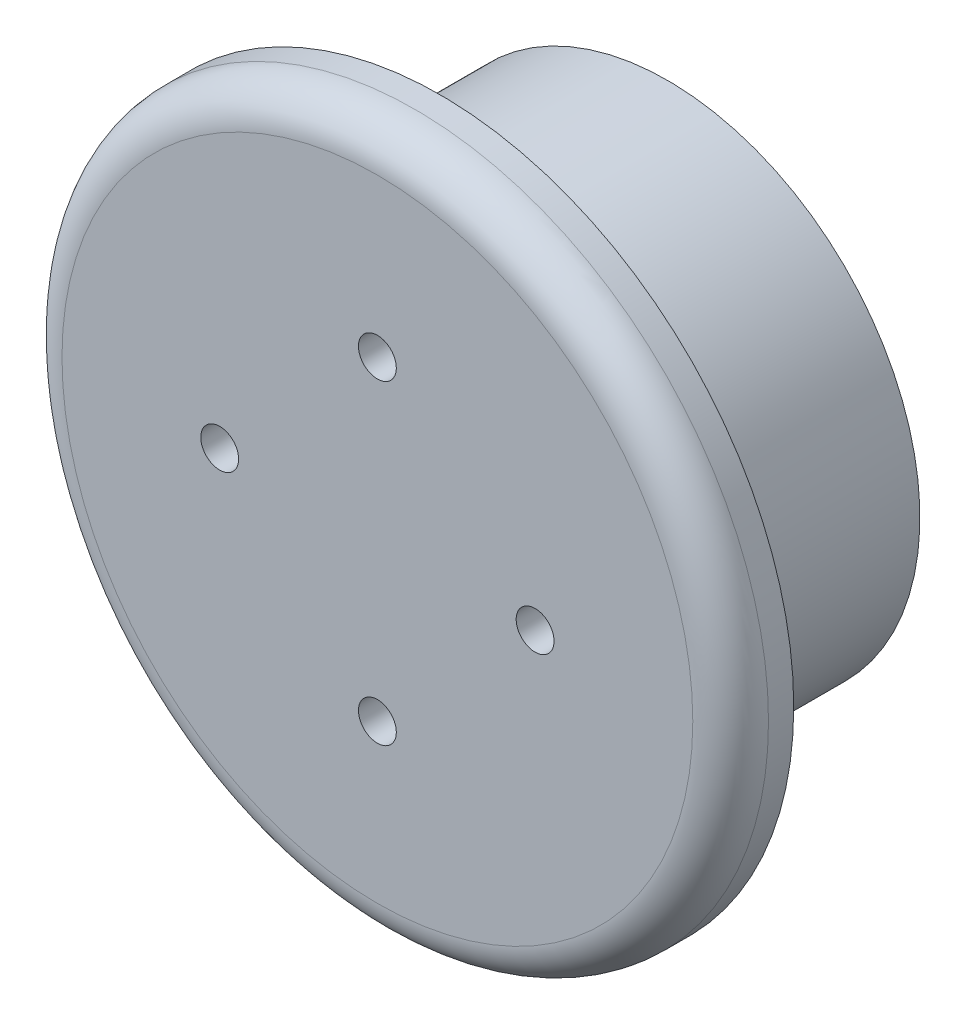
ISO-10303-21;
HEADER;
FILE_DESCRIPTION(('STEP AP214'),'2;1');
FILE_NAME('part.step','',(''),(''),'','','');
FILE_SCHEMA(('AUTOMOTIVE_DESIGN { 1 0 10303 214 1 1 1 1 }'));
ENDSEC;
DATA;
#1=APPLICATION_CONTEXT('core data for automotive mechanical design processes');
#2=APPLICATION_PROTOCOL_DEFINITION('international standard','automotive_design',2000,#1);
#3=PRODUCT_CONTEXT('',#1,'mechanical');
#4=PRODUCT('Part','Part','',(#3));
#5=PRODUCT_RELATED_PRODUCT_CATEGORY('part','',(#4));
#6=PRODUCT_DEFINITION_FORMATION('','',#4);
#7=PRODUCT_DEFINITION_CONTEXT('part definition',#1,'design');
#8=PRODUCT_DEFINITION('design','',#6,#7);
#9=PRODUCT_DEFINITION_SHAPE('','',#8);
#10=(LENGTH_UNIT() NAMED_UNIT(*) SI_UNIT(.MILLI.,.METRE.));
#11=(NAMED_UNIT(*) PLANE_ANGLE_UNIT() SI_UNIT($,.RADIAN.));
#12=(NAMED_UNIT(*) SI_UNIT($,.STERADIAN.) SOLID_ANGLE_UNIT());
#13=UNCERTAINTY_MEASURE_WITH_UNIT(LENGTH_MEASURE(1.E-05),#10,'distance_accuracy_value','');
#14=(GEOMETRIC_REPRESENTATION_CONTEXT(3) GLOBAL_UNCERTAINTY_ASSIGNED_CONTEXT((#13)) GLOBAL_UNIT_ASSIGNED_CONTEXT((#10,
#11,#12)) REPRESENTATION_CONTEXT('',''));
#15=CARTESIAN_POINT('',(0.,0.,0.));
#16=DIRECTION('',(0.,0.,1.));
#17=DIRECTION('',(1.,0.,0.));
#18=AXIS2_PLACEMENT_3D('',#15,#16,#17);
#19=CARTESIAN_POINT('',(0.,0.,5.));
#20=DIRECTION('',(0.,0.,-1.));
#21=DIRECTION('',(-1.,0.,0.));
#22=AXIS2_PLACEMENT_3D('',#19,#20,#21);
#23=CYLINDRICAL_SURFACE('',#22,28.);
#24=CARTESIAN_POINT('',(0.,0.,2.));
#25=DIRECTION('',(0.,0.,1.));
#26=DIRECTION('',(1.,0.,0.));
#27=AXIS2_PLACEMENT_3D('',#24,#25,#26);
#28=CIRCLE('',#27,28.);
#29=CARTESIAN_POINT('',(28.,0.,2.));
#30=VERTEX_POINT('',#29);
#31=EDGE_CURVE('E118',#30,#30,#28,.F.);
#32=ORIENTED_EDGE('',*,*,#31,.T.);
#33=EDGE_LOOP('',(#32));
#34=FACE_BOUND('',#33,.T.);
#35=CARTESIAN_POINT('',(0.,0.,0.));
#36=DIRECTION('',(0.,0.,1.));
#37=DIRECTION('',(1.,0.,0.));
#38=AXIS2_PLACEMENT_3D('',#35,#36,#37);
#39=CIRCLE('',#38,28.);
#40=CARTESIAN_POINT('',(28.,0.,0.));
#41=VERTEX_POINT('',#40);
#42=EDGE_CURVE('E114',#41,#41,#39,.T.);
#43=ORIENTED_EDGE('',*,*,#42,.T.);
#44=EDGE_LOOP('',(#43));
#45=FACE_BOUND('',#44,.T.);
#46=ADVANCED_FACE('F41',(#34,#45),#23,.T.);
#47=CARTESIAN_POINT('',(0.,0.,5.));
#48=DIRECTION('',(0.,0.,1.));
#49=DIRECTION('',(1.,0.,0.));
#50=AXIS2_PLACEMENT_3D('',#47,#48,#49);
#51=PLANE('',#50);
#52=CARTESIAN_POINT('',(0.,-12.5,5.));
#53=DIRECTION('',(0.,0.,1.));
#54=DIRECTION('',(1.,0.,0.));
#55=AXIS2_PLACEMENT_3D('',#52,#53,#54);
#56=CIRCLE('',#55,1.5);
#57=CARTESIAN_POINT('',(1.5,-12.5,5.));
#58=VERTEX_POINT('',#57);
#59=EDGE_CURVE('E74',#58,#58,#56,.T.);
#60=ORIENTED_EDGE('',*,*,#59,.F.);
#61=EDGE_LOOP('',(#60));
#62=FACE_BOUND('',#61,.T.);
#63=CARTESIAN_POINT('',(12.5,0.,5.));
#64=DIRECTION('',(0.,0.,1.));
#65=DIRECTION('',(1.,0.,0.));
#66=AXIS2_PLACEMENT_3D('',#63,#64,#65);
#67=CIRCLE('',#66,1.5);
#68=CARTESIAN_POINT('',(14.,0.,5.));
#69=VERTEX_POINT('',#68);
#70=EDGE_CURVE('E73',#69,#69,#67,.T.);
#71=ORIENTED_EDGE('',*,*,#70,.F.);
#72=EDGE_LOOP('',(#71));
#73=FACE_BOUND('',#72,.T.);
#74=CARTESIAN_POINT('',(-12.5,0.,5.));
#75=DIRECTION('',(0.,0.,1.));
#76=DIRECTION('',(1.,0.,0.));
#77=AXIS2_PLACEMENT_3D('',#74,#75,#76);
#78=CIRCLE('',#77,1.5);
#79=CARTESIAN_POINT('',(-11.,0.,5.));
#80=VERTEX_POINT('',#79);
#81=EDGE_CURVE('E84',#80,#80,#78,.T.);
#82=ORIENTED_EDGE('',*,*,#81,.F.);
#83=EDGE_LOOP('',(#82));
#84=FACE_BOUND('',#83,.T.);
#85=CARTESIAN_POINT('',(0.,12.5,5.));
#86=DIRECTION('',(0.,0.,1.));
#87=DIRECTION('',(1.,0.,0.));
#88=AXIS2_PLACEMENT_3D('',#85,#86,#87);
#89=CIRCLE('',#88,1.5);
#90=CARTESIAN_POINT('',(1.5,12.5,5.));
#91=VERTEX_POINT('',#90);
#92=EDGE_CURVE('E90',#91,#91,#89,.T.);
#93=ORIENTED_EDGE('',*,*,#92,.F.);
#94=EDGE_LOOP('',(#93));
#95=FACE_BOUND('',#94,.T.);
#96=CARTESIAN_POINT('',(0.,0.,5.));
#97=DIRECTION('',(0.,0.,1.));
#98=DIRECTION('',(1.,0.,0.));
#99=AXIS2_PLACEMENT_3D('',#96,#97,#98);
#100=CIRCLE('',#99,25.);
#101=CARTESIAN_POINT('',(25.,0.,5.));
#102=VERTEX_POINT('',#101);
#103=EDGE_CURVE('E121',#102,#102,#100,.T.);
#104=ORIENTED_EDGE('',*,*,#103,.T.);
#105=EDGE_LOOP('',(#104));
#106=FACE_BOUND('',#105,.T.);
#107=ADVANCED_FACE('F148',(#62,#73,#84,#95,#106),#51,.T.);
#108=CARTESIAN_POINT('',(0.,0.,0.));
#109=DIRECTION('',(0.,0.,1.));
#110=DIRECTION('',(1.,0.,0.));
#111=AXIS2_PLACEMENT_3D('',#108,#109,#110);
#112=PLANE('',#111);
#113=CARTESIAN_POINT('',(0.,0.,0.));
#114=DIRECTION('',(0.,0.,-1.));
#115=DIRECTION('',(-1.,0.,0.));
#116=AXIS2_PLACEMENT_3D('',#113,#114,#115);
#117=CIRCLE('',#116,19.075);
#118=CARTESIAN_POINT('',(-19.075,0.,0.));
#119=VERTEX_POINT('',#118);
#120=EDGE_CURVE('E115',#119,#119,#117,.T.);
#121=ORIENTED_EDGE('',*,*,#120,.F.);
#122=EDGE_LOOP('',(#121));
#123=FACE_BOUND('',#122,.T.);
#124=ORIENTED_EDGE('',*,*,#42,.F.);
#125=EDGE_LOOP('',(#124));
#126=FACE_BOUND('',#125,.T.);
#127=ADVANCED_FACE('F154',(#123,#126),#112,.F.);
#128=CARTESIAN_POINT('',(0.,0.,2.));
#129=DIRECTION('',(0.,0.,1.));
#130=DIRECTION('',(1.,0.,0.));
#131=AXIS2_PLACEMENT_3D('',#128,#129,#130);
#132=TOROIDAL_SURFACE('',#131,25.,3.);
#133=ORIENTED_EDGE('',*,*,#31,.F.);
#134=EDGE_LOOP('',(#133));
#135=FACE_BOUND('',#134,.T.);
#136=ORIENTED_EDGE('',*,*,#103,.F.);
#137=EDGE_LOOP('',(#136));
#138=FACE_BOUND('',#137,.T.);
#139=ADVANCED_FACE('F159',(#135,#138),#132,.T.);
#140=CARTESIAN_POINT('',(0.,0.,0.));
#141=DIRECTION('',(0.,0.,-1.));
#142=DIRECTION('',(-1.,0.,0.));
#143=AXIS2_PLACEMENT_3D('',#140,#141,#142);
#144=CYLINDRICAL_SURFACE('',#143,19.075);
#145=CARTESIAN_POINT('',(0.,0.,-2.));
#146=DIRECTION('',(0.,0.,-1.));
#147=DIRECTION('',(-1.,0.,0.));
#148=AXIS2_PLACEMENT_3D('',#145,#146,#147);
#149=CIRCLE('',#148,19.075);
#150=CARTESIAN_POINT('',(-19.075,0.,-2.));
#151=VERTEX_POINT('',#150);
#152=EDGE_CURVE('E111',#151,#151,#149,.T.);
#153=ORIENTED_EDGE('',*,*,#152,.F.);
#154=EDGE_LOOP('',(#153));
#155=FACE_BOUND('',#154,.T.);
#156=ORIENTED_EDGE('',*,*,#120,.T.);
#157=EDGE_LOOP('',(#156));
#158=FACE_BOUND('',#157,.T.);
#159=ADVANCED_FACE('F160',(#155,#158),#144,.T.);
#160=CARTESIAN_POINT('',(0.,-19.075,-2.));
#161=DIRECTION('',(0.,0.,-1.));
#162=DIRECTION('',(-1.,0.,0.));
#163=AXIS2_PLACEMENT_3D('',#160,#161,#162);
#164=PLANE('',#163);
#165=CARTESIAN_POINT('',(0.,0.,-2.));
#166=DIRECTION('',(0.,0.,-1.));
#167=DIRECTION('',(-1.,0.,0.));
#168=AXIS2_PLACEMENT_3D('',#165,#166,#167);
#169=CIRCLE('',#168,20.);
#170=CARTESIAN_POINT('',(-20.,0.,-2.));
#171=VERTEX_POINT('',#170);
#172=EDGE_CURVE('E108',#171,#171,#169,.T.);
#173=ORIENTED_EDGE('',*,*,#172,.F.);
#174=EDGE_LOOP('',(#173));
#175=FACE_BOUND('',#174,.T.);
#176=ORIENTED_EDGE('',*,*,#152,.T.);
#177=EDGE_LOOP('',(#176));
#178=FACE_BOUND('',#177,.T.);
#179=ADVANCED_FACE('F166',(#175,#178),#164,.F.);
#180=CARTESIAN_POINT('',(0.,0.,0.));
#181=DIRECTION('',(0.,0.,-1.));
#182=DIRECTION('',(-1.,0.,0.));
#183=AXIS2_PLACEMENT_3D('',#180,#181,#182);
#184=CYLINDRICAL_SURFACE('',#183,20.);
#185=CARTESIAN_POINT('',(0.,0.,-18.));
#186=DIRECTION('',(0.,0.,-1.));
#187=DIRECTION('',(-1.,0.,0.));
#188=AXIS2_PLACEMENT_3D('',#185,#186,#187);
#189=CIRCLE('',#188,20.);
#190=CARTESIAN_POINT('',(-20.,0.,-18.));
#191=VERTEX_POINT('',#190);
#192=EDGE_CURVE('E105',#191,#191,#189,.T.);
#193=ORIENTED_EDGE('',*,*,#192,.F.);
#194=EDGE_LOOP('',(#193));
#195=FACE_BOUND('',#194,.T.);
#196=ORIENTED_EDGE('',*,*,#172,.T.);
#197=EDGE_LOOP('',(#196));
#198=FACE_BOUND('',#197,.T.);
#199=ADVANCED_FACE('F193',(#195,#198),#184,.T.);
#200=CARTESIAN_POINT('',(0.,-20.,-18.));
#201=DIRECTION('',(0.,0.,1.));
#202=DIRECTION('',(1.,0.,0.));
#203=AXIS2_PLACEMENT_3D('',#200,#201,#202);
#204=PLANE('',#203);
#205=CARTESIAN_POINT('',(0.,0.,-18.));
#206=DIRECTION('',(0.,0.,1.));
#207=DIRECTION('',(1.,0.,0.));
#208=AXIS2_PLACEMENT_3D('',#205,#206,#207);
#209=CIRCLE('',#208,18.5);
#210=CARTESIAN_POINT('',(18.5,0.,-18.));
#211=VERTEX_POINT('',#210);
#212=EDGE_CURVE('E11',#211,#211,#209,.T.);
#213=ORIENTED_EDGE('',*,*,#212,.T.);
#214=EDGE_LOOP('',(#213));
#215=FACE_BOUND('',#214,.T.);
#216=ORIENTED_EDGE('',*,*,#192,.T.);
#217=EDGE_LOOP('',(#216));
#218=FACE_BOUND('',#217,.T.);
#219=ADVANCED_FACE('F202',(#215,#218),#204,.F.);
#220=CARTESIAN_POINT('',(0.,0.,0.));
#221=DIRECTION('',(0.,0.,-1.));
#222=DIRECTION('',(-1.,0.,0.));
#223=AXIS2_PLACEMENT_3D('',#220,#221,#222);
#224=CYLINDRICAL_SURFACE('',#223,17.5);
#225=CARTESIAN_POINT('',(0.,0.,-17.));
#226=DIRECTION('',(0.,0.,1.));
#227=DIRECTION('',(1.,0.,0.));
#228=AXIS2_PLACEMENT_3D('',#225,#226,#227);
#229=CIRCLE('',#228,17.5);
#230=CARTESIAN_POINT('',(17.5,0.,-17.));
#231=VERTEX_POINT('',#230);
#232=EDGE_CURVE('E50',#231,#231,#229,.F.);
#233=ORIENTED_EDGE('',*,*,#232,.T.);
#234=EDGE_LOOP('',(#233));
#235=FACE_BOUND('',#234,.T.);
#236=CARTESIAN_POINT('',(0.,0.,-8.));
#237=DIRECTION('',(0.,0.,-1.));
#238=DIRECTION('',(-1.,0.,0.));
#239=AXIS2_PLACEMENT_3D('',#236,#237,#238);
#240=CIRCLE('',#239,17.5);
#241=CARTESIAN_POINT('',(-17.5,0.,-8.));
#242=VERTEX_POINT('',#241);
#243=EDGE_CURVE('E102',#242,#242,#240,.T.);
#244=ORIENTED_EDGE('',*,*,#243,.F.);
#245=EDGE_LOOP('',(#244));
#246=FACE_BOUND('',#245,.T.);
#247=ADVANCED_FACE('F128',(#235,#246),#224,.F.);
#248=CARTESIAN_POINT('',(0.,-17.5,-8.));
#249=DIRECTION('',(0.,0.,1.));
#250=DIRECTION('',(1.,0.,0.));
#251=AXIS2_PLACEMENT_3D('',#248,#249,#250);
#252=PLANE('',#251);
#253=CARTESIAN_POINT('',(0.,0.,-8.));
#254=DIRECTION('',(0.,0.,-1.));
#255=DIRECTION('',(-1.,0.,0.));
#256=AXIS2_PLACEMENT_3D('',#253,#254,#255);
#257=CIRCLE('',#256,12.);
#258=CARTESIAN_POINT('',(-12.,0.,-8.));
#259=VERTEX_POINT('',#258);
#260=EDGE_CURVE('E99',#259,#259,#257,.T.);
#261=ORIENTED_EDGE('',*,*,#260,.F.);
#262=EDGE_LOOP('',(#261));
#263=FACE_BOUND('',#262,.T.);
#264=ORIENTED_EDGE('',*,*,#243,.T.);
#265=EDGE_LOOP('',(#264));
#266=FACE_BOUND('',#265,.T.);
#267=ADVANCED_FACE('F209',(#263,#266),#252,.F.);
#268=CARTESIAN_POINT('',(0.,0.,0.));
#269=DIRECTION('',(0.,0.,-1.));
#270=DIRECTION('',(-1.,0.,0.));
#271=AXIS2_PLACEMENT_3D('',#268,#269,#270);
#272=CYLINDRICAL_SURFACE('',#271,12.);
#273=CARTESIAN_POINT('',(0.,0.,-2.));
#274=DIRECTION('',(0.,0.,-1.));
#275=DIRECTION('',(-1.,0.,0.));
#276=AXIS2_PLACEMENT_3D('',#273,#274,#275);
#277=CIRCLE('',#276,12.);
#278=CARTESIAN_POINT('',(-12.,0.,-2.));
#279=VERTEX_POINT('',#278);
#280=EDGE_CURVE('E96',#279,#279,#277,.T.);
#281=ORIENTED_EDGE('',*,*,#280,.F.);
#282=EDGE_LOOP('',(#281));
#283=FACE_BOUND('',#282,.T.);
#284=ORIENTED_EDGE('',*,*,#260,.T.);
#285=EDGE_LOOP('',(#284));
#286=FACE_BOUND('',#285,.T.);
#287=ADVANCED_FACE('F143',(#283,#286),#272,.F.);
#288=CARTESIAN_POINT('',(0.,-12.,-2.));
#289=DIRECTION('',(0.,0.,1.));
#290=DIRECTION('',(1.,0.,0.));
#291=AXIS2_PLACEMENT_3D('',#288,#289,#290);
#292=PLANE('',#291);
#293=ORIENTED_EDGE('',*,*,#280,.T.);
#294=EDGE_LOOP('',(#293));
#295=FACE_BOUND('',#294,.T.);
#296=ADVANCED_FACE('F133',(#295),#292,.F.);
#297=CARTESIAN_POINT('',(0.,0.,-17.));
#298=DIRECTION('',(0.,0.,-1.));
#299=DIRECTION('',(-1.,0.,0.));
#300=AXIS2_PLACEMENT_3D('',#297,#298,#299);
#301=CONICAL_SURFACE('',#300,17.5,0.785398163397448);
#302=ORIENTED_EDGE('',*,*,#212,.F.);
#303=EDGE_LOOP('',(#302));
#304=FACE_BOUND('',#303,.T.);
#305=ORIENTED_EDGE('',*,*,#232,.F.);
#306=EDGE_LOOP('',(#305));
#307=FACE_BOUND('',#306,.T.);
#308=ADVANCED_FACE('F44',(#304,#307),#301,.F.);
#309=CARTESIAN_POINT('',(0.,12.5,1.90129092854134));
#310=DIRECTION('',(0.,0.,1.));
#311=DIRECTION('',(1.,0.,0.));
#312=AXIS2_PLACEMENT_3D('',#309,#310,#311);
#313=CONICAL_SURFACE('',#312,1.5,1.02974425867665);
#314=CARTESIAN_POINT('',(0.,12.5,1.));
#315=VERTEX_POINT('',#314);
#316=VERTEX_LOOP('',#315);
#317=FACE_BOUND('',#316,.T.);
#318=CARTESIAN_POINT('',(0.,12.5,1.90129092854134));
#319=DIRECTION('',(0.,0.,1.));
#320=DIRECTION('',(1.,0.,0.));
#321=AXIS2_PLACEMENT_3D('',#318,#319,#320);
#322=CIRCLE('',#321,1.5);
#323=CARTESIAN_POINT('',(1.5,12.5,1.90129092854134));
#324=VERTEX_POINT('',#323);
#325=EDGE_CURVE('E93',#324,#324,#322,.T.);
#326=ORIENTED_EDGE('',*,*,#325,.T.);
#327=EDGE_LOOP('',(#326));
#328=FACE_BOUND('',#327,.T.);
#329=ADVANCED_FACE('F132',(#317,#328),#313,.F.);
#330=CARTESIAN_POINT('',(0.,12.5,5.));
#331=DIRECTION('',(0.,0.,1.));
#332=DIRECTION('',(1.,0.,0.));
#333=AXIS2_PLACEMENT_3D('',#330,#331,#332);
#334=CYLINDRICAL_SURFACE('',#333,1.5);
#335=ORIENTED_EDGE('',*,*,#325,.F.);
#336=EDGE_LOOP('',(#335));
#337=FACE_BOUND('',#336,.T.);
#338=ORIENTED_EDGE('',*,*,#92,.T.);
#339=EDGE_LOOP('',(#338));
#340=FACE_BOUND('',#339,.T.);
#341=ADVANCED_FACE('F140',(#337,#340),#334,.F.);
#342=CARTESIAN_POINT('',(-12.5,0.,1.90129092854134));
#343=DIRECTION('',(0.,0.,1.));
#344=DIRECTION('',(1.,0.,0.));
#345=AXIS2_PLACEMENT_3D('',#342,#343,#344);
#346=CONICAL_SURFACE('',#345,1.5,1.02974425867665);
#347=CARTESIAN_POINT('',(-12.5,0.,1.));
#348=VERTEX_POINT('',#347);
#349=VERTEX_LOOP('',#348);
#350=FACE_BOUND('',#349,.T.);
#351=CARTESIAN_POINT('',(-12.5,0.,1.90129092854134));
#352=DIRECTION('',(0.,0.,1.));
#353=DIRECTION('',(1.,0.,0.));
#354=AXIS2_PLACEMENT_3D('',#351,#352,#353);
#355=CIRCLE('',#354,1.5);
#356=CARTESIAN_POINT('',(-11.,0.,1.90129092854134));
#357=VERTEX_POINT('',#356);
#358=EDGE_CURVE('E87',#357,#357,#355,.T.);
#359=ORIENTED_EDGE('',*,*,#358,.T.);
#360=EDGE_LOOP('',(#359));
#361=FACE_BOUND('',#360,.T.);
#362=ADVANCED_FACE('F262',(#350,#361),#346,.F.);
#363=CARTESIAN_POINT('',(-12.5,0.,5.));
#364=DIRECTION('',(0.,0.,1.));
#365=DIRECTION('',(1.,0.,0.));
#366=AXIS2_PLACEMENT_3D('',#363,#364,#365);
#367=CYLINDRICAL_SURFACE('',#366,1.5);
#368=ORIENTED_EDGE('',*,*,#358,.F.);
#369=EDGE_LOOP('',(#368));
#370=FACE_BOUND('',#369,.T.);
#371=ORIENTED_EDGE('',*,*,#81,.T.);
#372=EDGE_LOOP('',(#371));
#373=FACE_BOUND('',#372,.T.);
#374=ADVANCED_FACE('F271',(#370,#373),#367,.F.);
#375=CARTESIAN_POINT('',(12.5,0.,1.90129092854134));
#376=DIRECTION('',(0.,0.,1.));
#377=DIRECTION('',(1.,0.,0.));
#378=AXIS2_PLACEMENT_3D('',#375,#376,#377);
#379=CONICAL_SURFACE('',#378,1.5,1.02974425867665);
#380=CARTESIAN_POINT('',(12.5,0.,1.));
#381=VERTEX_POINT('',#380);
#382=VERTEX_LOOP('',#381);
#383=FACE_BOUND('',#382,.T.);
#384=CARTESIAN_POINT('',(12.5,0.,1.90129092854134));
#385=DIRECTION('',(0.,0.,1.));
#386=DIRECTION('',(1.,0.,0.));
#387=AXIS2_PLACEMENT_3D('',#384,#385,#386);
#388=CIRCLE('',#387,1.5);
#389=CARTESIAN_POINT('',(14.,0.,1.90129092854134));
#390=VERTEX_POINT('',#389);
#391=EDGE_CURVE('E77',#390,#390,#388,.T.);
#392=ORIENTED_EDGE('',*,*,#391,.T.);
#393=EDGE_LOOP('',(#392));
#394=FACE_BOUND('',#393,.T.);
#395=ADVANCED_FACE('F279',(#383,#394),#379,.F.);
#396=CARTESIAN_POINT('',(12.5,0.,5.));
#397=DIRECTION('',(0.,0.,1.));
#398=DIRECTION('',(1.,0.,0.));
#399=AXIS2_PLACEMENT_3D('',#396,#397,#398);
#400=CYLINDRICAL_SURFACE('',#399,1.5);
#401=ORIENTED_EDGE('',*,*,#391,.F.);
#402=EDGE_LOOP('',(#401));
#403=FACE_BOUND('',#402,.T.);
#404=ORIENTED_EDGE('',*,*,#70,.T.);
#405=EDGE_LOOP('',(#404));
#406=FACE_BOUND('',#405,.T.);
#407=ADVANCED_FACE('F67',(#403,#406),#400,.F.);
#408=CARTESIAN_POINT('',(0.,-12.5,1.90129092854134));
#409=DIRECTION('',(0.,0.,1.));
#410=DIRECTION('',(1.,0.,0.));
#411=AXIS2_PLACEMENT_3D('',#408,#409,#410);
#412=CONICAL_SURFACE('',#411,1.5,1.02974425867665);
#413=CARTESIAN_POINT('',(0.,-12.5,1.));
#414=VERTEX_POINT('',#413);
#415=VERTEX_LOOP('',#414);
#416=FACE_BOUND('',#415,.T.);
#417=CARTESIAN_POINT('',(0.,-12.5,1.90129092854134));
#418=DIRECTION('',(0.,0.,1.));
#419=DIRECTION('',(1.,0.,0.));
#420=AXIS2_PLACEMENT_3D('',#417,#418,#419);
#421=CIRCLE('',#420,1.5);
#422=CARTESIAN_POINT('',(1.5,-12.5,1.90129092854134));
#423=VERTEX_POINT('',#422);
#424=EDGE_CURVE('E71',#423,#423,#421,.T.);
#425=ORIENTED_EDGE('',*,*,#424,.T.);
#426=EDGE_LOOP('',(#425));
#427=FACE_BOUND('',#426,.T.);
#428=ADVANCED_FACE('F63',(#416,#427),#412,.F.);
#429=CARTESIAN_POINT('',(0.,-12.5,5.));
#430=DIRECTION('',(0.,0.,1.));
#431=DIRECTION('',(1.,0.,0.));
#432=AXIS2_PLACEMENT_3D('',#429,#430,#431);
#433=CYLINDRICAL_SURFACE('',#432,1.5);
#434=ORIENTED_EDGE('',*,*,#424,.F.);
#435=EDGE_LOOP('',(#434));
#436=FACE_BOUND('',#435,.T.);
#437=ORIENTED_EDGE('',*,*,#59,.T.);
#438=EDGE_LOOP('',(#437));
#439=FACE_BOUND('',#438,.T.);
#440=ADVANCED_FACE('F66',(#436,#439),#433,.F.);
#441=CLOSED_SHELL('',(#46,#107,#127,#139,#159,#179,#199,#219,#247,#267,#287,#296,#308,#329,#341,
#362,#374,#395,#407,#428,#440));
#442=MANIFOLD_SOLID_BREP('B2',#441);
#443=ADVANCED_BREP_SHAPE_REPRESENTATION('',(#18,#442),#14);
#444=SHAPE_DEFINITION_REPRESENTATION(#9,#443);
ENDSEC;
END-ISO-10303-21;
